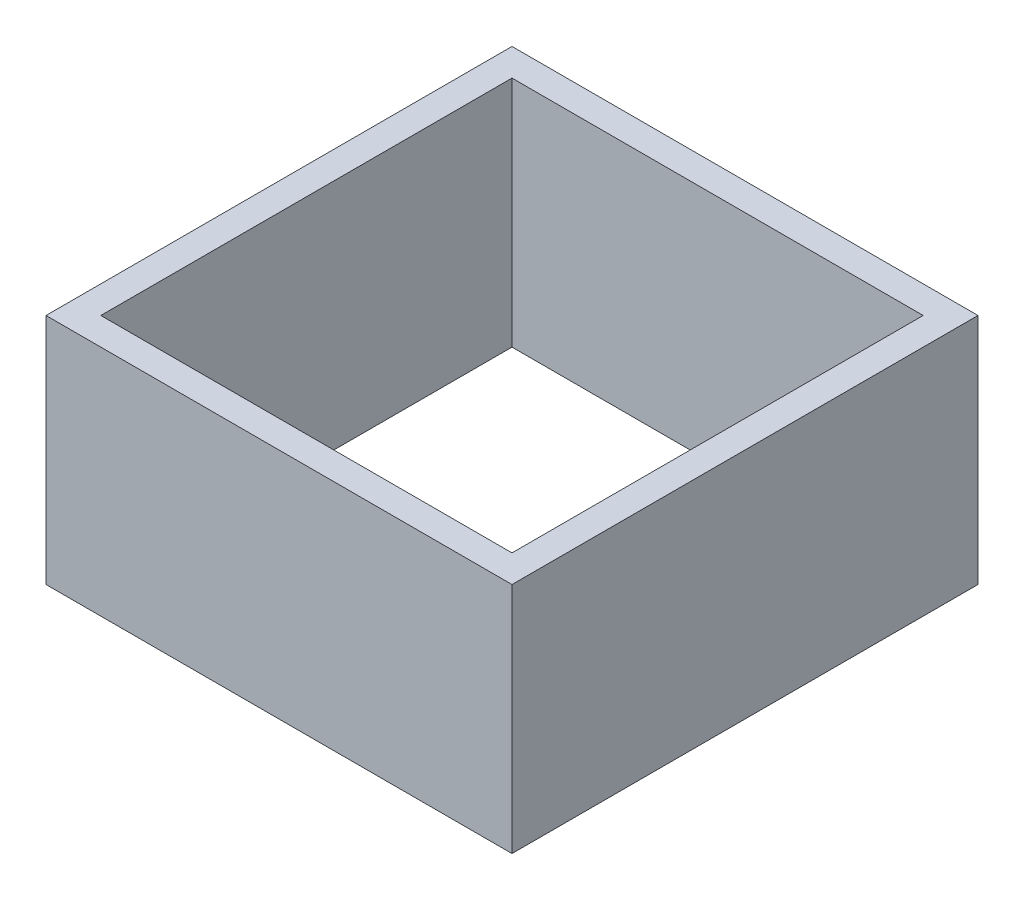
ISO-10303-21;
HEADER;
FILE_DESCRIPTION(('STEP AP214'),'2;1');
FILE_NAME('part.step','',(''),(''),'','','');
FILE_SCHEMA(('AUTOMOTIVE_DESIGN { 1 0 10303 214 1 1 1 1 }'));
ENDSEC;
DATA;
#1=APPLICATION_CONTEXT('core data for automotive mechanical design processes');
#2=APPLICATION_PROTOCOL_DEFINITION('international standard','automotive_design',2000,#1);
#3=PRODUCT_CONTEXT('',#1,'mechanical');
#4=PRODUCT('Part','Part','',(#3));
#5=PRODUCT_RELATED_PRODUCT_CATEGORY('part','',(#4));
#6=PRODUCT_DEFINITION_FORMATION('','',#4);
#7=PRODUCT_DEFINITION_CONTEXT('part definition',#1,'design');
#8=PRODUCT_DEFINITION('design','',#6,#7);
#9=PRODUCT_DEFINITION_SHAPE('','',#8);
#10=(LENGTH_UNIT() NAMED_UNIT(*) SI_UNIT(.MILLI.,.METRE.));
#11=(NAMED_UNIT(*) PLANE_ANGLE_UNIT() SI_UNIT($,.RADIAN.));
#12=(NAMED_UNIT(*) SI_UNIT($,.STERADIAN.) SOLID_ANGLE_UNIT());
#13=UNCERTAINTY_MEASURE_WITH_UNIT(LENGTH_MEASURE(1.E-05),#10,'distance_accuracy_value','');
#14=(GEOMETRIC_REPRESENTATION_CONTEXT(3) GLOBAL_UNCERTAINTY_ASSIGNED_CONTEXT((#13)) GLOBAL_UNIT_ASSIGNED_CONTEXT((#10,
#11,#12)) REPRESENTATION_CONTEXT('',''));
#15=CARTESIAN_POINT('',(0.,0.,0.));
#16=DIRECTION('',(0.,0.,1.));
#17=DIRECTION('',(1.,0.,0.));
#18=AXIS2_PLACEMENT_3D('',#15,#16,#17);
#19=CARTESIAN_POINT('',(85.,85.,85.));
#20=DIRECTION('',(-1.,0.,0.));
#21=DIRECTION('',(0.,0.,1.));
#22=AXIS2_PLACEMENT_3D('',#19,#20,#21);
#23=PLANE('',#22);
#24=DIRECTION('',(0.,0.,-1.));
#25=VECTOR('',#24,1.);
#26=CARTESIAN_POINT('',(85.,0.,85.));
#27=LINE('',#26,#25);
#28=CARTESIAN_POINT('',(85.,0.,85.));
#29=VERTEX_POINT('',#28);
#30=CARTESIAN_POINT('',(85.,0.,-85.));
#31=VERTEX_POINT('',#30);
#32=EDGE_CURVE('E132',#29,#31,#27,.T.);
#33=ORIENTED_EDGE('',*,*,#32,.T.);
#34=DIRECTION('',(0.,-1.,0.));
#35=VECTOR('',#34,1.);
#36=CARTESIAN_POINT('',(85.,85.,-85.));
#37=LINE('',#36,#35);
#38=CARTESIAN_POINT('',(85.,85.,-85.));
#39=VERTEX_POINT('',#38);
#40=EDGE_CURVE('E11',#39,#31,#37,.T.);
#41=ORIENTED_EDGE('',*,*,#40,.F.);
#42=DIRECTION('',(0.,0.,-1.));
#43=VECTOR('',#42,1.);
#44=CARTESIAN_POINT('',(85.,85.,85.));
#45=LINE('',#44,#43);
#46=CARTESIAN_POINT('',(85.,85.,85.));
#47=VERTEX_POINT('',#46);
#48=EDGE_CURVE('E136',#47,#39,#45,.T.);
#49=ORIENTED_EDGE('',*,*,#48,.F.);
#50=DIRECTION('',(0.,-1.,0.));
#51=VECTOR('',#50,1.);
#52=CARTESIAN_POINT('',(85.,85.,85.));
#53=LINE('',#52,#51);
#54=EDGE_CURVE('E146',#47,#29,#53,.T.);
#55=ORIENTED_EDGE('',*,*,#54,.T.);
#56=EDGE_LOOP('',(#33,#41,#49,#55));
#57=FACE_BOUND('',#56,.T.);
#58=ADVANCED_FACE('F35',(#57),#23,.F.);
#59=CARTESIAN_POINT('',(-85.,85.,-85.));
#60=DIRECTION('',(0.,0.,1.));
#61=DIRECTION('',(1.,0.,0.));
#62=AXIS2_PLACEMENT_3D('',#59,#60,#61);
#63=PLANE('',#62);
#64=DIRECTION('',(-1.,0.,0.));
#65=VECTOR('',#64,1.);
#66=CARTESIAN_POINT('',(-85.,0.,-85.));
#67=LINE('',#66,#65);
#68=CARTESIAN_POINT('',(-85.,0.,-85.));
#69=VERTEX_POINT('',#68);
#70=EDGE_CURVE('E149',#31,#69,#67,.T.);
#71=ORIENTED_EDGE('',*,*,#70,.T.);
#72=DIRECTION('',(0.,-1.,0.));
#73=VECTOR('',#72,1.);
#74=CARTESIAN_POINT('',(-85.,85.,-85.));
#75=LINE('',#74,#73);
#76=CARTESIAN_POINT('',(-85.,85.,-85.));
#77=VERTEX_POINT('',#76);
#78=EDGE_CURVE('E42',#77,#69,#75,.T.);
#79=ORIENTED_EDGE('',*,*,#78,.F.);
#80=DIRECTION('',(-1.,0.,0.));
#81=VECTOR('',#80,1.);
#82=CARTESIAN_POINT('',(-85.,85.,-85.));
#83=LINE('',#82,#81);
#84=EDGE_CURVE('E139',#39,#77,#83,.T.);
#85=ORIENTED_EDGE('',*,*,#84,.F.);
#86=ORIENTED_EDGE('',*,*,#40,.T.);
#87=EDGE_LOOP('',(#71,#79,#85,#86));
#88=FACE_BOUND('',#87,.T.);
#89=ADVANCED_FACE('F177',(#88),#63,.F.);
#90=CARTESIAN_POINT('',(-85.,85.,85.));
#91=DIRECTION('',(1.,0.,0.));
#92=DIRECTION('',(0.,0.,-1.));
#93=AXIS2_PLACEMENT_3D('',#90,#91,#92);
#94=PLANE('',#93);
#95=DIRECTION('',(0.,0.,1.));
#96=VECTOR('',#95,1.);
#97=CARTESIAN_POINT('',(-85.,0.,85.));
#98=LINE('',#97,#96);
#99=CARTESIAN_POINT('',(-85.,0.,85.));
#100=VERTEX_POINT('',#99);
#101=EDGE_CURVE('E151',#69,#100,#98,.T.);
#102=ORIENTED_EDGE('',*,*,#101,.T.);
#103=DIRECTION('',(0.,-1.,0.));
#104=VECTOR('',#103,1.);
#105=CARTESIAN_POINT('',(-85.,85.,85.));
#106=LINE('',#105,#104);
#107=CARTESIAN_POINT('',(-85.,85.,85.));
#108=VERTEX_POINT('',#107);
#109=EDGE_CURVE('E156',#108,#100,#106,.T.);
#110=ORIENTED_EDGE('',*,*,#109,.F.);
#111=DIRECTION('',(0.,0.,1.));
#112=VECTOR('',#111,1.);
#113=CARTESIAN_POINT('',(-85.,85.,85.));
#114=LINE('',#113,#112);
#115=EDGE_CURVE('E142',#77,#108,#114,.T.);
#116=ORIENTED_EDGE('',*,*,#115,.F.);
#117=ORIENTED_EDGE('',*,*,#78,.T.);
#118=EDGE_LOOP('',(#102,#110,#116,#117));
#119=FACE_BOUND('',#118,.T.);
#120=ADVANCED_FACE('F163',(#119),#94,.F.);
#121=CARTESIAN_POINT('',(-85.,85.,85.));
#122=DIRECTION('',(0.,0.,-1.));
#123=DIRECTION('',(-1.,0.,0.));
#124=AXIS2_PLACEMENT_3D('',#121,#122,#123);
#125=PLANE('',#124);
#126=DIRECTION('',(1.,0.,0.));
#127=VECTOR('',#126,1.);
#128=CARTESIAN_POINT('',(-85.,0.,85.));
#129=LINE('',#128,#127);
#130=EDGE_CURVE('E140',#100,#29,#129,.T.);
#131=ORIENTED_EDGE('',*,*,#130,.T.);
#132=ORIENTED_EDGE('',*,*,#54,.F.);
#133=DIRECTION('',(1.,0.,0.));
#134=VECTOR('',#133,1.);
#135=CARTESIAN_POINT('',(-85.,85.,85.));
#136=LINE('',#135,#134);
#137=EDGE_CURVE('E144',#108,#47,#136,.T.);
#138=ORIENTED_EDGE('',*,*,#137,.F.);
#139=ORIENTED_EDGE('',*,*,#109,.T.);
#140=EDGE_LOOP('',(#131,#132,#138,#139));
#141=FACE_BOUND('',#140,.T.);
#142=ADVANCED_FACE('F170',(#141),#125,.F.);
#143=CARTESIAN_POINT('',(0.,85.,0.));
#144=DIRECTION('',(0.,-1.,0.));
#145=DIRECTION('',(0.,0.,-1.));
#146=AXIS2_PLACEMENT_3D('',#143,#144,#145);
#147=PLANE('',#146);
#148=DIRECTION('',(1.,0.,0.));
#149=VECTOR('',#148,1.);
#150=CARTESIAN_POINT('',(75.,85.,75.));
#151=LINE('',#150,#149);
#152=CARTESIAN_POINT('',(-75.,85.,75.));
#153=VERTEX_POINT('',#152);
#154=CARTESIAN_POINT('',(75.,85.,75.));
#155=VERTEX_POINT('',#154);
#156=EDGE_CURVE('E126',#153,#155,#151,.T.);
#157=ORIENTED_EDGE('',*,*,#156,.F.);
#158=DIRECTION('',(0.,0.,1.));
#159=VECTOR('',#158,1.);
#160=CARTESIAN_POINT('',(-75.,85.,-75.));
#161=LINE('',#160,#159);
#162=CARTESIAN_POINT('',(-75.,85.,-75.));
#163=VERTEX_POINT('',#162);
#164=EDGE_CURVE('E49',#163,#153,#161,.T.);
#165=ORIENTED_EDGE('',*,*,#164,.F.);
#166=DIRECTION('',(-1.,0.,0.));
#167=VECTOR('',#166,1.);
#168=CARTESIAN_POINT('',(75.,85.,-75.));
#169=LINE('',#168,#167);
#170=CARTESIAN_POINT('',(75.,85.,-75.));
#171=VERTEX_POINT('',#170);
#172=EDGE_CURVE('E117',#171,#163,#169,.T.);
#173=ORIENTED_EDGE('',*,*,#172,.F.);
#174=DIRECTION('',(0.,0.,-1.));
#175=VECTOR('',#174,1.);
#176=CARTESIAN_POINT('',(75.,85.,-75.));
#177=LINE('',#176,#175);
#178=EDGE_CURVE('E120',#155,#171,#177,.T.);
#179=ORIENTED_EDGE('',*,*,#178,.F.);
#180=EDGE_LOOP('',(#157,#165,#173,#179));
#181=FACE_BOUND('',#180,.T.);
#182=ORIENTED_EDGE('',*,*,#48,.T.);
#183=ORIENTED_EDGE('',*,*,#84,.T.);
#184=ORIENTED_EDGE('',*,*,#115,.T.);
#185=ORIENTED_EDGE('',*,*,#137,.T.);
#186=EDGE_LOOP('',(#182,#183,#184,#185));
#187=FACE_BOUND('',#186,.T.);
#188=ADVANCED_FACE('F176',(#181,#187),#147,.F.);
#189=CARTESIAN_POINT('',(0.,0.,0.));
#190=DIRECTION('',(0.,-1.,0.));
#191=DIRECTION('',(0.,0.,-1.));
#192=AXIS2_PLACEMENT_3D('',#189,#190,#191);
#193=PLANE('',#192);
#194=DIRECTION('',(0.,0.,1.));
#195=VECTOR('',#194,1.);
#196=CARTESIAN_POINT('',(-75.,0.,-75.));
#197=LINE('',#196,#195);
#198=CARTESIAN_POINT('',(-75.,0.,-75.));
#199=VERTEX_POINT('',#198);
#200=CARTESIAN_POINT('',(-75.,0.,75.));
#201=VERTEX_POINT('',#200);
#202=EDGE_CURVE('E101',#199,#201,#197,.T.);
#203=ORIENTED_EDGE('',*,*,#202,.T.);
#204=DIRECTION('',(1.,0.,0.));
#205=VECTOR('',#204,1.);
#206=CARTESIAN_POINT('',(75.,0.,75.));
#207=LINE('',#206,#205);
#208=CARTESIAN_POINT('',(75.,0.,75.));
#209=VERTEX_POINT('',#208);
#210=EDGE_CURVE('E110',#201,#209,#207,.T.);
#211=ORIENTED_EDGE('',*,*,#210,.T.);
#212=DIRECTION('',(0.,0.,-1.));
#213=VECTOR('',#212,1.);
#214=CARTESIAN_POINT('',(75.,0.,-75.));
#215=LINE('',#214,#213);
#216=CARTESIAN_POINT('',(75.,0.,-75.));
#217=VERTEX_POINT('',#216);
#218=EDGE_CURVE('E57',#209,#217,#215,.T.);
#219=ORIENTED_EDGE('',*,*,#218,.T.);
#220=DIRECTION('',(-1.,0.,0.));
#221=VECTOR('',#220,1.);
#222=CARTESIAN_POINT('',(75.,0.,-75.));
#223=LINE('',#222,#221);
#224=EDGE_CURVE('E107',#217,#199,#223,.T.);
#225=ORIENTED_EDGE('',*,*,#224,.T.);
#226=EDGE_LOOP('',(#203,#211,#219,#225));
#227=FACE_BOUND('',#226,.T.);
#228=ORIENTED_EDGE('',*,*,#32,.F.);
#229=ORIENTED_EDGE('',*,*,#130,.F.);
#230=ORIENTED_EDGE('',*,*,#101,.F.);
#231=ORIENTED_EDGE('',*,*,#70,.F.);
#232=EDGE_LOOP('',(#228,#229,#230,#231));
#233=FACE_BOUND('',#232,.T.);
#234=ADVANCED_FACE('F114',(#227,#233),#193,.T.);
#235=CARTESIAN_POINT('',(-75.,0.,-75.));
#236=DIRECTION('',(-1.,0.,0.));
#237=DIRECTION('',(0.,0.,1.));
#238=AXIS2_PLACEMENT_3D('',#235,#236,#237);
#239=PLANE('',#238);
#240=ORIENTED_EDGE('',*,*,#164,.T.);
#241=DIRECTION('',(0.,1.,0.));
#242=VECTOR('',#241,1.);
#243=CARTESIAN_POINT('',(-75.,0.,75.));
#244=LINE('',#243,#242);
#245=EDGE_CURVE('E97',#201,#153,#244,.T.);
#246=ORIENTED_EDGE('',*,*,#245,.F.);
#247=ORIENTED_EDGE('',*,*,#202,.F.);
#248=DIRECTION('',(0.,1.,0.));
#249=VECTOR('',#248,1.);
#250=CARTESIAN_POINT('',(-75.,0.,-75.));
#251=LINE('',#250,#249);
#252=EDGE_CURVE('E130',#199,#163,#251,.T.);
#253=ORIENTED_EDGE('',*,*,#252,.T.);
#254=EDGE_LOOP('',(#240,#246,#247,#253));
#255=FACE_BOUND('',#254,.T.);
#256=ADVANCED_FACE('F99',(#255),#239,.F.);
#257=CARTESIAN_POINT('',(75.,0.,-75.));
#258=DIRECTION('',(0.,0.,-1.));
#259=DIRECTION('',(-1.,0.,0.));
#260=AXIS2_PLACEMENT_3D('',#257,#258,#259);
#261=PLANE('',#260);
#262=ORIENTED_EDGE('',*,*,#172,.T.);
#263=ORIENTED_EDGE('',*,*,#252,.F.);
#264=ORIENTED_EDGE('',*,*,#224,.F.);
#265=DIRECTION('',(0.,1.,0.));
#266=VECTOR('',#265,1.);
#267=CARTESIAN_POINT('',(75.,0.,-75.));
#268=LINE('',#267,#266);
#269=EDGE_CURVE('E133',#217,#171,#268,.T.);
#270=ORIENTED_EDGE('',*,*,#269,.T.);
#271=EDGE_LOOP('',(#262,#263,#264,#270));
#272=FACE_BOUND('',#271,.T.);
#273=ADVANCED_FACE('F194',(#272),#261,.F.);
#274=CARTESIAN_POINT('',(75.,0.,-75.));
#275=DIRECTION('',(1.,0.,0.));
#276=DIRECTION('',(0.,0.,-1.));
#277=AXIS2_PLACEMENT_3D('',#274,#275,#276);
#278=PLANE('',#277);
#279=ORIENTED_EDGE('',*,*,#178,.T.);
#280=ORIENTED_EDGE('',*,*,#269,.F.);
#281=ORIENTED_EDGE('',*,*,#218,.F.);
#282=DIRECTION('',(0.,1.,0.));
#283=VECTOR('',#282,1.);
#284=CARTESIAN_POINT('',(75.,0.,75.));
#285=LINE('',#284,#283);
#286=EDGE_CURVE('E106',#209,#155,#285,.T.);
#287=ORIENTED_EDGE('',*,*,#286,.T.);
#288=EDGE_LOOP('',(#279,#280,#281,#287));
#289=FACE_BOUND('',#288,.T.);
#290=ADVANCED_FACE('F197',(#289),#278,.F.);
#291=CARTESIAN_POINT('',(75.,0.,75.));
#292=DIRECTION('',(0.,0.,1.));
#293=DIRECTION('',(1.,0.,0.));
#294=AXIS2_PLACEMENT_3D('',#291,#292,#293);
#295=PLANE('',#294);
#296=ORIENTED_EDGE('',*,*,#156,.T.);
#297=ORIENTED_EDGE('',*,*,#286,.F.);
#298=ORIENTED_EDGE('',*,*,#210,.F.);
#299=ORIENTED_EDGE('',*,*,#245,.T.);
#300=EDGE_LOOP('',(#296,#297,#298,#299));
#301=FACE_BOUND('',#300,.T.);
#302=ADVANCED_FACE('F111',(#301),#295,.F.);
#303=CLOSED_SHELL('',(#58,#89,#120,#142,#188,#234,#256,#273,#290,#302));
#304=MANIFOLD_SOLID_BREP('B2',#303);
#305=ADVANCED_BREP_SHAPE_REPRESENTATION('',(#18,#304),#14);
#306=SHAPE_DEFINITION_REPRESENTATION(#9,#305);
ENDSEC;
END-ISO-10303-21;
